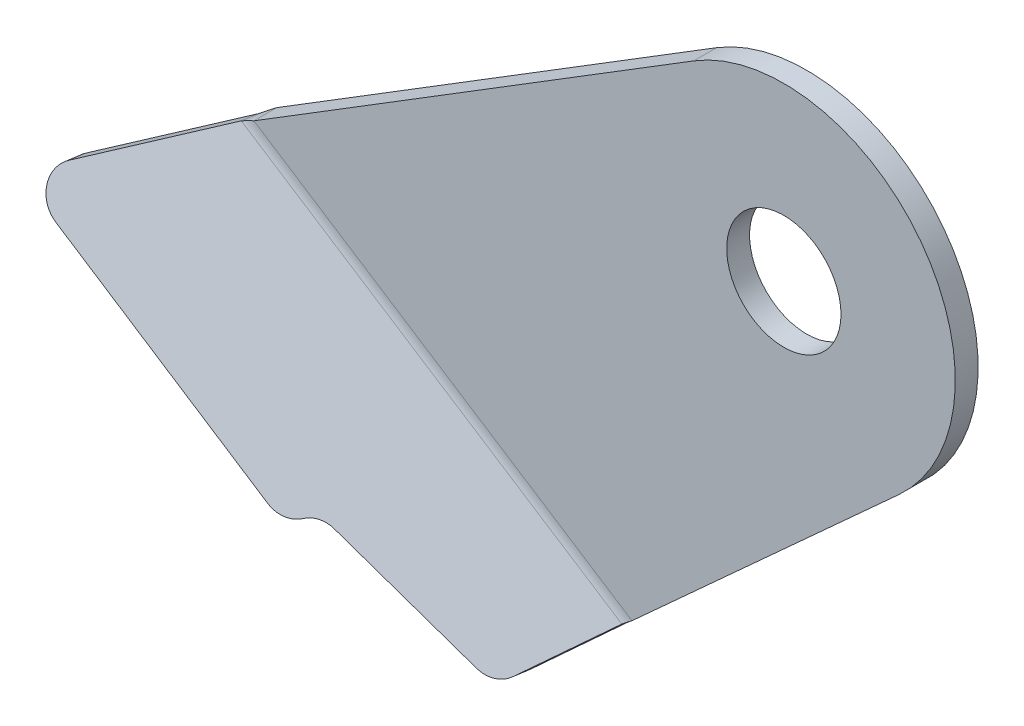
ISO-10303-21;
HEADER;
FILE_DESCRIPTION(('STEP AP214'),'2;1');
FILE_NAME('part.step','',(''),(''),'','','');
FILE_SCHEMA(('AUTOMOTIVE_DESIGN { 1 0 10303 214 1 1 1 1 }'));
ENDSEC;
DATA;
#1=APPLICATION_CONTEXT('core data for automotive mechanical design processes');
#2=APPLICATION_PROTOCOL_DEFINITION('international standard','automotive_design',2000,#1);
#3=PRODUCT_CONTEXT('',#1,'mechanical');
#4=PRODUCT('Part','Part','',(#3));
#5=PRODUCT_RELATED_PRODUCT_CATEGORY('part','',(#4));
#6=PRODUCT_DEFINITION_FORMATION('','',#4);
#7=PRODUCT_DEFINITION_CONTEXT('part definition',#1,'design');
#8=PRODUCT_DEFINITION('design','',#6,#7);
#9=PRODUCT_DEFINITION_SHAPE('','',#8);
#10=(LENGTH_UNIT() NAMED_UNIT(*) SI_UNIT(.MILLI.,.METRE.));
#11=(NAMED_UNIT(*) PLANE_ANGLE_UNIT() SI_UNIT($,.RADIAN.));
#12=(NAMED_UNIT(*) SI_UNIT($,.STERADIAN.) SOLID_ANGLE_UNIT());
#13=UNCERTAINTY_MEASURE_WITH_UNIT(LENGTH_MEASURE(1.E-05),#10,'distance_accuracy_value','');
#14=(GEOMETRIC_REPRESENTATION_CONTEXT(3) GLOBAL_UNCERTAINTY_ASSIGNED_CONTEXT((#13)) GLOBAL_UNIT_ASSIGNED_CONTEXT((#10,
#11,#12)) REPRESENTATION_CONTEXT('',''));
#15=CARTESIAN_POINT('',(0.,0.,0.));
#16=DIRECTION('',(0.,0.,1.));
#17=DIRECTION('',(1.,0.,0.));
#18=AXIS2_PLACEMENT_3D('',#15,#16,#17);
#19=CARTESIAN_POINT('',(-24.1058777703323,-34.2801994195561,7.82589486316085));
#20=DIRECTION('',(0.681189490017153,-0.726810174085109,0.0879081881086429));
#21=DIRECTION('',(0.708244189758442,0.623811060153185,-0.330529770072178));
#22=AXIS2_PLACEMENT_3D('',#19,#20,#21);
#23=PLANE('',#22);
#24=DIRECTION('',(0.708244189758442,0.623811060153185,-0.330529770072178));
#25=VECTOR('',#24,1.);
#26=CARTESIAN_POINT('',(-24.3413285309593,-34.6452150331494,6.63248523476275));
#27=LINE('',#26,#25);
#28=CARTESIAN_POINT('',(-13.2496668437784,-24.8758426387205,1.45612877438336));
#29=VERTEX_POINT('',#28);
#30=CARTESIAN_POINT('',(-9.1381483520542,-21.2544776543686,-0.462671663895728));
#31=VERTEX_POINT('',#30);
#32=EDGE_CURVE('E193',#29,#31,#27,.T.);
#33=ORIENTED_EDGE('',*,*,#32,.T.);
#34=CARTESIAN_POINT('',(-8.90269759142722,-20.8894620407753,0.730737964502371));
#35=CARTESIAN_POINT('',(-9.13814835205418,-21.2544776543686,-0.462671663895733));
#36=B_SPLINE_CURVE_WITH_KNOTS('',1,(#34,#35),.UNSPECIFIED.,.F.,.F.,(2,2),(0.,1.),.UNSPECIFIED.);
#37=CARTESIAN_POINT('',(-8.90269759142722,-20.8894620407753,0.730737964502372));
#38=VERTEX_POINT('',#37);
#39=EDGE_CURVE('E459',#38,#31,#36,.T.);
#40=ORIENTED_EDGE('',*,*,#39,.F.);
#41=DIRECTION('',(0.708244189758442,0.623811060153185,-0.330529770072178));
#42=VECTOR('',#41,1.);
#43=CARTESIAN_POINT('',(-24.1058777703323,-34.2801994195561,7.82589486316085));
#44=LINE('',#43,#42);
#45=CARTESIAN_POINT('',(-13.0142160831514,-24.5108270251272,2.64953840278146));
#46=VERTEX_POINT('',#45);
#47=EDGE_CURVE('E174',#46,#38,#44,.T.);
#48=ORIENTED_EDGE('',*,*,#47,.F.);
#49=DIRECTION('',(-0.185394299706273,-0.287413868971092,-0.939692620785908));
#50=VECTOR('',#49,1.);
#51=CARTESIAN_POINT('',(-13.0142160831514,-24.5108270251272,2.64953840278146));
#52=LINE('',#51,#50);
#53=EDGE_CURVE('E196',#29,#46,#52,.F.);
#54=ORIENTED_EDGE('',*,*,#53,.F.);
#55=EDGE_LOOP('',(#33,#40,#48,#54));
#56=FACE_BOUND('',#55,.T.);
#57=ADVANCED_FACE('F41',(#56),#23,.T.);
#58=CARTESIAN_POINT('',(-0.848453338513683,-1.315343875459,-8.19673876667266));
#59=DIRECTION('',(-0.185394299706273,-0.287413868971092,-0.939692620785908));
#60=DIRECTION('',(0.982280158208957,-0.027470792223861,-0.185394299706273));
#61=AXIS2_PLACEMENT_3D('',#58,#59,#60);
#62=PLANE('',#61);
#63=CARTESIAN_POINT('',(-1793.39457663359,1107.59457283347,6.2885763424069));
#64=DIRECTION('',(0.185394299706273,0.287413868971092,0.939692620785908));
#65=DIRECTION('',(-0.839892739048491,0.542752333990855,-0.000301398579555717));
#66=AXIS2_PLACEMENT_3D('',#63,#64,#65);
#67=ELLIPSE('',#66,5245.43301631365,12.7);
#68=CARTESIAN_POINT('',(-37.1913494955494,-14.2528583972485,2.93050290216552));
#69=VERTEX_POINT('',#68);
#70=CARTESIAN_POINT('',(-25.4191314438474,-21.8767700467203,2.9397780864022));
#71=VERTEX_POINT('',#70);
#72=EDGE_CURVE('E221',#69,#71,#67,.F.);
#73=ORIENTED_EDGE('',*,*,#72,.F.);
#74=CARTESIAN_POINT('',(-36.3801575777716,-13.0009307873301,2.38754693520737));
#75=DIRECTION('',(0.185394299706273,0.287413868971092,0.939692620785908));
#76=DIRECTION('',(0.,-0.956270320284859,0.292484315036369));
#77=AXIS2_PLACEMENT_3D('',#74,#75,#76);
#78=CIRCLE('',#77,1.5875);
#79=CARTESIAN_POINT('',(-37.2370628673345,-11.6851057140426,2.15415038161286));
#80=VERTEX_POINT('',#79);
#81=EDGE_CURVE('E598',#80,#69,#78,.T.);
#82=ORIENTED_EDGE('',*,*,#81,.F.);
#83=DIRECTION('',(-0.82113544446347,-0.479973030996368,0.308808146527806));
#84=VECTOR('',#83,1.);
#85=CARTESIAN_POINT('',(-5.98988507588822,6.57960656426175,-9.59711808823895));
#86=LINE('',#85,#84);
#87=CARTESIAN_POINT('',(-30.2788094741487,-7.61784251880893,-0.462671663895731));
#88=VERTEX_POINT('',#87);
#89=EDGE_CURVE('E192',#88,#80,#86,.T.);
#90=ORIENTED_EDGE('',*,*,#89,.F.);
#91=DIRECTION('',(-0.840341934765575,0.542056669246353,0.));
#92=VECTOR('',#91,1.);
#93=CARTESIAN_POINT('',(-12.3667102144121,-19.1719164763956,-0.462671663895731));
#94=LINE('',#93,#92);
#95=EDGE_CURVE('E164',#31,#88,#94,.T.);
#96=ORIENTED_EDGE('',*,*,#95,.F.);
#97=ORIENTED_EDGE('',*,*,#32,.F.);
#98=CARTESIAN_POINT('',(-14.3310551591806,-23.7220314873604,1.31657452576088));
#99=DIRECTION('',(0.185394299706273,0.287413868971092,0.939692620785908));
#100=DIRECTION('',(0.,-0.956270320284859,0.292484315036369));
#101=AXIS2_PLACEMENT_3D('',#98,#99,#100);
#102=CIRCLE('',#101,1.5875);
#103=CARTESIAN_POINT('',(-14.8987638120875,-25.1046888575057,1.85147800508938));
#104=VERTEX_POINT('',#103);
#105=EDGE_CURVE('E206',#104,#29,#102,.T.);
#106=ORIENTED_EDGE('',*,*,#105,.F.);
#107=DIRECTION('',(-0.915282901619304,0.398513189198997,0.0586894201521124));
#108=VECTOR('',#107,1.);
#109=CARTESIAN_POINT('',(-11.2656716986377,-26.6865332492485,1.61851826212865));
#110=LINE('',#109,#108);
#111=CARTESIAN_POINT('',(-22.3233306196092,-21.8720404690655,2.32755323826937));
#112=VERTEX_POINT('',#111);
#113=EDGE_CURVE('E226',#104,#112,#110,.T.);
#114=ORIENTED_EDGE('',*,*,#113,.T.);
#115=CARTESIAN_POINT('',(-22.8910392725161,-23.2546978392107,2.86245671759787));
#116=DIRECTION('',(0.185394299706273,0.287413868971092,0.939692620785908));
#117=DIRECTION('',(0.,-0.956270320284859,0.292484315036369));
#118=AXIS2_PLACEMENT_3D('',#115,#116,#117);
#119=CIRCLE('',#118,1.5875);
#120=CARTESIAN_POINT('',(-23.7494838080497,-21.9397737590015,2.62963942292625));
#121=VERTEX_POINT('',#120);
#122=EDGE_CURVE('E211',#121,#112,#119,.F.);
#123=ORIENTED_EDGE('',*,*,#122,.F.);
#124=CARTESIAN_POINT('',(-24.6079283435839,-20.6248496787914,2.3968221282545));
#125=DIRECTION('',(0.185394299706273,0.287413868971092,0.939692620785908));
#126=DIRECTION('',(0.,-0.956270320284859,0.292484315036369));
#127=AXIS2_PLACEMENT_3D('',#124,#125,#126);
#128=CIRCLE('',#127,1.5875);
#129=EDGE_CURVE('E11',#71,#121,#128,.T.);
#130=ORIENTED_EDGE('',*,*,#129,.F.);
#131=EDGE_LOOP('',(#73,#82,#90,#96,#97,#106,#114,#123,#130));
#132=FACE_BOUND('',#131,.T.);
#133=ADVANCED_FACE('F438',(#132),#62,.T.);
#134=CARTESIAN_POINT('',(-0.613002577886717,-0.950328261865718,-7.00332913827456));
#135=DIRECTION('',(-0.185394299706273,-0.287413868971092,-0.939692620785908));
#136=DIRECTION('',(0.982280158208957,-0.027470792223861,-0.185394299706273));
#137=AXIS2_PLACEMENT_3D('',#134,#135,#136);
#138=PLANE('',#137);
#139=CARTESIAN_POINT('',(-22.6555885118891,-22.8896822256174,4.05586634599597));
#140=DIRECTION('',(0.185394299706273,0.287413868971092,0.939692620785908));
#141=DIRECTION('',(0.,-0.956270320284859,0.292484315036369));
#142=AXIS2_PLACEMENT_3D('',#139,#140,#141);
#143=CIRCLE('',#142,1.5875);
#144=CARTESIAN_POINT('',(-22.0878798589823,-21.5070248554722,3.52096286666748));
#145=VERTEX_POINT('',#144);
#146=CARTESIAN_POINT('',(-23.5140330474228,-21.5747581454082,3.82304905132436));
#147=VERTEX_POINT('',#146);
#148=EDGE_CURVE('E208',#145,#147,#143,.T.);
#149=ORIENTED_EDGE('',*,*,#148,.F.);
#150=DIRECTION('',(-0.915282901619304,0.398513189198997,0.0586894201521124));
#151=VECTOR('',#150,1.);
#152=CARTESIAN_POINT('',(-11.0302209380108,-26.3215176356552,2.81192789052676));
#153=LINE('',#152,#151);
#154=CARTESIAN_POINT('',(-14.6633130514605,-24.7396732439124,3.04488763348748));
#155=VERTEX_POINT('',#154);
#156=EDGE_CURVE('E222',#155,#145,#153,.T.);
#157=ORIENTED_EDGE('',*,*,#156,.F.);
#158=CARTESIAN_POINT('',(-14.0956043985537,-23.3570158737671,2.50998415415899));
#159=DIRECTION('',(0.185394299706273,0.287413868971092,0.939692620785908));
#160=DIRECTION('',(0.,-0.956270320284859,0.292484315036369));
#161=AXIS2_PLACEMENT_3D('',#158,#159,#160);
#162=CIRCLE('',#161,1.5875);
#163=EDGE_CURVE('E199',#46,#155,#162,.F.);
#164=ORIENTED_EDGE('',*,*,#163,.F.);
#165=ORIENTED_EDGE('',*,*,#47,.T.);
#166=DIRECTION('',(-0.840341934765575,0.542056669246353,0.));
#167=VECTOR('',#166,1.);
#168=CARTESIAN_POINT('',(-12.1312594537851,-18.8069008628023,0.730737964502371));
#169=LINE('',#168,#167);
#170=CARTESIAN_POINT('',(-30.0433587135218,-7.25282690521564,0.730737964502369));
#171=VERTEX_POINT('',#170);
#172=EDGE_CURVE('E139',#38,#171,#169,.T.);
#173=ORIENTED_EDGE('',*,*,#172,.T.);
#174=DIRECTION('',(-0.82113544446347,-0.479973030996368,0.308808146527806));
#175=VECTOR('',#174,1.);
#176=CARTESIAN_POINT('',(-5.75443431526125,6.94462217785504,-8.40370845984084));
#177=LINE('',#176,#175);
#178=CARTESIAN_POINT('',(-37.0016121067075,-11.3200901004493,3.34756001001097));
#179=VERTEX_POINT('',#178);
#180=EDGE_CURVE('E168',#171,#179,#177,.T.);
#181=ORIENTED_EDGE('',*,*,#180,.T.);
#182=CARTESIAN_POINT('',(-36.1447068171446,-12.6359151737369,3.58095656360548));
#183=DIRECTION('',(0.185394299706273,0.287413868971092,0.939692620785908));
#184=DIRECTION('',(0.,-0.956270320284859,0.292484315036369));
#185=AXIS2_PLACEMENT_3D('',#182,#183,#184);
#186=CIRCLE('',#185,1.5875);
#187=CARTESIAN_POINT('',(-36.9558987349224,-13.8878427836553,4.12391253056362));
#188=VERTEX_POINT('',#187);
#189=EDGE_CURVE('E220',#188,#179,#186,.F.);
#190=ORIENTED_EDGE('',*,*,#189,.F.);
#191=CARTESIAN_POINT('',(-1793.15912587296,1107.95958844706,7.48198597080501));
#192=DIRECTION('',(0.185394299706273,0.287413868971092,0.939692620785908));
#193=DIRECTION('',(-0.839892739048491,0.542752333990855,-0.000301398579555717));
#194=AXIS2_PLACEMENT_3D('',#191,#192,#193);
#195=ELLIPSE('',#194,5245.43301631365,12.7);
#196=CARTESIAN_POINT('',(-25.1836806832166,-21.5117544331295,4.13318771480031));
#197=VERTEX_POINT('',#196);
#198=EDGE_CURVE('E219',#188,#197,#195,.F.);
#199=ORIENTED_EDGE('',*,*,#198,.T.);
#200=CARTESIAN_POINT('',(-24.3724775829569,-20.2598340651981,3.5902317566526));
#201=DIRECTION('',(0.185394299706273,0.287413868971092,0.939692620785908));
#202=DIRECTION('',(0.,-0.956270320284859,0.292484315036369));
#203=AXIS2_PLACEMENT_3D('',#200,#201,#202);
#204=CIRCLE('',#203,1.5875);
#205=EDGE_CURVE('E216',#147,#197,#204,.F.);
#206=ORIENTED_EDGE('',*,*,#205,.F.);
#207=EDGE_LOOP('',(#149,#157,#164,#165,#173,#181,#190,#199,#206));
#208=FACE_BOUND('',#207,.T.);
#209=ADVANCED_FACE('F177',(#208),#138,.F.);
#210=CARTESIAN_POINT('',(-1793.15912587296,1107.95958844706,7.48198597080501));
#211=DIRECTION('',(0.185394299706273,0.287413868971092,0.939692620785908));
#212=DIRECTION('',(-0.839892739048491,0.542752333990855,-0.000301398579555717));
#213=AXIS2_PLACEMENT_3D('',#210,#211,#212);
#214=ELLIPSE('',#213,5245.43301631365,12.7);
#215=DIRECTION('',(-0.185394299706273,-0.287413868971092,-0.939692620785908));
#216=VECTOR('',#215,1.);
#217=SURFACE_OF_LINEAR_EXTRUSION('',#214,#216);
#218=ORIENTED_EDGE('',*,*,#198,.F.);
#219=DIRECTION('',(-0.185394299706273,-0.287413868971092,-0.939692620785908));
#220=VECTOR('',#219,1.);
#221=CARTESIAN_POINT('',(-37.1913494955493,-14.2528583972486,2.93050290216554));
#222=LINE('',#221,#220);
#223=EDGE_CURVE('E469',#69,#188,#222,.F.);
#224=ORIENTED_EDGE('',*,*,#223,.F.);
#225=ORIENTED_EDGE('',*,*,#72,.T.);
#226=DIRECTION('',(-0.185394299706273,-0.287413868971092,-0.939692620785908));
#227=VECTOR('',#226,1.);
#228=CARTESIAN_POINT('',(-25.1836806832204,-21.5117544331271,4.13318771480037));
#229=LINE('',#228,#227);
#230=EDGE_CURVE('E49',#197,#71,#229,.T.);
#231=ORIENTED_EDGE('',*,*,#230,.F.);
#232=EDGE_LOOP('',(#218,#224,#225,#231));
#233=FACE_BOUND('',#232,.T.);
#234=ADVANCED_FACE('F241',(#233),#217,.T.);
#235=CARTESIAN_POINT('',(-5.75443431526125,6.94462217785504,-8.40370845984084));
#236=DIRECTION('',(-0.539782859566882,0.828866187897194,-0.147021451083075));
#237=DIRECTION('',(-0.82113544446347,-0.479973030996368,0.308808146527806));
#238=AXIS2_PLACEMENT_3D('',#235,#236,#237);
#239=PLANE('',#238);
#240=ORIENTED_EDGE('',*,*,#180,.F.);
#241=CARTESIAN_POINT('',(-30.2788094741487,-7.61784251880893,-0.462671663895733));
#242=CARTESIAN_POINT('',(-30.0433587135218,-7.25282690521564,0.73073796450237));
#243=B_SPLINE_CURVE_WITH_KNOTS('',1,(#241,#242),.UNSPECIFIED.,.F.,.F.,(2,2),(0.,1.),.UNSPECIFIED.);
#244=EDGE_CURVE('E154',#88,#171,#243,.T.);
#245=ORIENTED_EDGE('',*,*,#244,.F.);
#246=ORIENTED_EDGE('',*,*,#89,.T.);
#247=DIRECTION('',(-0.185394299706273,-0.287413868971092,-0.939692620785908));
#248=VECTOR('',#247,1.);
#249=CARTESIAN_POINT('',(-37.0016121067075,-11.3200901004493,3.34756001001097));
#250=LINE('',#249,#248);
#251=EDGE_CURVE('E170',#179,#80,#250,.T.);
#252=ORIENTED_EDGE('',*,*,#251,.F.);
#253=EDGE_LOOP('',(#240,#245,#246,#252));
#254=FACE_BOUND('',#253,.T.);
#255=ADVANCED_FACE('F169',(#254),#239,.T.);
#256=CARTESIAN_POINT('',(0.,0.,0.635));
#257=DIRECTION('',(0.,0.,-1.));
#258=DIRECTION('',(1.,0.,0.));
#259=AXIS2_PLACEMENT_3D('',#256,#257,#258);
#260=CYLINDRICAL_SURFACE('',#259,9.52499999999997);
#261=DIRECTION('',(0.,0.,1.));
#262=VECTOR('',#261,1.);
#263=CARTESIAN_POINT('',(-5.00758457991113,8.10245158424509,0.635));
#264=LINE('',#263,#262);
#265=CARTESIAN_POINT('',(-5.00758457991113,8.10245158424509,-0.635));
#266=VERTEX_POINT('',#265);
#267=CARTESIAN_POINT('',(-5.00758457991113,8.10245158424509,0.635));
#268=VERTEX_POINT('',#267);
#269=EDGE_CURVE('E347',#266,#268,#264,.T.);
#270=ORIENTED_EDGE('',*,*,#269,.T.);
#271=CARTESIAN_POINT('',(0.,0.,0.635));
#272=DIRECTION('',(0.,0.,1.));
#273=DIRECTION('',(1.,0.,0.));
#274=AXIS2_PLACEMENT_3D('',#271,#272,#273);
#275=CIRCLE('',#274,9.52499999999997);
#276=CARTESIAN_POINT('',(6.40829897849284,-7.04693757615654,0.635));
#277=VERTEX_POINT('',#276);
#278=EDGE_CURVE('E357',#277,#268,#275,.T.);
#279=ORIENTED_EDGE('',*,*,#278,.F.);
#280=DIRECTION('',(0.,0.,1.));
#281=VECTOR('',#280,1.);
#282=CARTESIAN_POINT('',(6.40829897849284,-7.04693757615654,0.635));
#283=LINE('',#282,#281);
#284=CARTESIAN_POINT('',(6.40829897849284,-7.04693757615654,-0.635));
#285=VERTEX_POINT('',#284);
#286=EDGE_CURVE('E360',#285,#277,#283,.T.);
#287=ORIENTED_EDGE('',*,*,#286,.F.);
#288=CARTESIAN_POINT('',(0.,0.,-0.635));
#289=DIRECTION('',(0.,0.,1.));
#290=DIRECTION('',(1.,0.,0.));
#291=AXIS2_PLACEMENT_3D('',#288,#289,#290);
#292=CIRCLE('',#291,9.52499999999997);
#293=EDGE_CURVE('E337',#285,#266,#292,.T.);
#294=ORIENTED_EDGE('',*,*,#293,.T.);
#295=EDGE_LOOP('',(#270,#279,#287,#294));
#296=FACE_BOUND('',#295,.T.);
#297=ADVANCED_FACE('F300',(#296),#260,.T.);
#298=CARTESIAN_POINT('',(0.,0.,0.635));
#299=DIRECTION('',(0.,0.,-1.));
#300=DIRECTION('',(1.,0.,0.));
#301=AXIS2_PLACEMENT_3D('',#298,#299,#300);
#302=CYLINDRICAL_SURFACE('',#301,3.175);
#303=CARTESIAN_POINT('',(0.,0.,0.635));
#304=DIRECTION('',(0.,0.,1.));
#305=DIRECTION('',(1.,0.,0.));
#306=AXIS2_PLACEMENT_3D('',#303,#304,#305);
#307=CIRCLE('',#306,3.175);
#308=CARTESIAN_POINT('',(3.175,0.,0.635));
#309=VERTEX_POINT('',#308);
#310=EDGE_CURVE('E351',#309,#309,#307,.T.);
#311=ORIENTED_EDGE('',*,*,#310,.T.);
#312=EDGE_LOOP('',(#311));
#313=FACE_BOUND('',#312,.T.);
#314=CARTESIAN_POINT('',(0.,0.,-0.635));
#315=DIRECTION('',(0.,0.,1.));
#316=DIRECTION('',(1.,0.,0.));
#317=AXIS2_PLACEMENT_3D('',#314,#315,#316);
#318=CIRCLE('',#317,3.175);
#319=CARTESIAN_POINT('',(3.175,0.,-0.635));
#320=VERTEX_POINT('',#319);
#321=EDGE_CURVE('E354',#320,#320,#318,.T.);
#322=ORIENTED_EDGE('',*,*,#321,.F.);
#323=EDGE_LOOP('',(#322));
#324=FACE_BOUND('',#323,.T.);
#325=ADVANCED_FACE('F430',(#313,#324),#302,.F.);
#326=CARTESIAN_POINT('',(0.,0.,0.635));
#327=DIRECTION('',(0.,0.,-1.));
#328=DIRECTION('',(1.,0.,0.));
#329=AXIS2_PLACEMENT_3D('',#326,#327,#328);
#330=PLANE('',#329);
#331=ORIENTED_EDGE('',*,*,#310,.F.);
#332=EDGE_LOOP('',(#331));
#333=FACE_BOUND('',#332,.T.);
#334=DIRECTION('',(0.739835966000689,0.672787294329959,0.));
#335=VECTOR('',#334,1.);
#336=CARTESIAN_POINT('',(-24.9102407943313,-35.5271907733956,0.635));
#337=LINE('',#336,#335);
#338=CARTESIAN_POINT('',(-8.43499419259654,-20.5450364932809,0.635));
#339=VERTEX_POINT('',#338);
#340=EDGE_CURVE('E404',#339,#277,#337,.T.);
#341=ORIENTED_EDGE('',*,*,#340,.T.);
#342=ORIENTED_EDGE('',*,*,#278,.T.);
#343=DIRECTION('',(-0.850651084960117,-0.525730664557601,0.));
#344=VECTOR('',#343,1.);
#345=CARTESIAN_POINT('',(-5.00758457991113,8.10245158424509,0.635));
#346=LINE('',#345,#344);
#347=CARTESIAN_POINT('',(-29.4386628353385,-6.99676739539894,0.635));
#348=VERTEX_POINT('',#347);
#349=EDGE_CURVE('E350',#268,#348,#346,.T.);
#350=ORIENTED_EDGE('',*,*,#349,.T.);
#351=DIRECTION('',(-0.840341934765575,0.542056669246353,0.));
#352=VECTOR('',#351,1.);
#353=CARTESIAN_POINT('',(-11.8369460030014,-18.3506313458107,0.635));
#354=LINE('',#353,#352);
#355=EDGE_CURVE('E142',#339,#348,#354,.T.);
#356=ORIENTED_EDGE('',*,*,#355,.F.);
#357=EDGE_LOOP('',(#341,#342,#350,#356));
#358=FACE_BOUND('',#357,.T.);
#359=ADVANCED_FACE('F389',(#333,#358),#330,.F.);
#360=CARTESIAN_POINT('',(-5.00758457991113,8.10245158424509,0.635));
#361=DIRECTION('',(-0.525730664557601,0.850651084960117,0.));
#362=DIRECTION('',(-0.850651084960117,-0.525730664557601,0.));
#363=AXIS2_PLACEMENT_3D('',#360,#361,#362);
#364=PLANE('',#363);
#365=CARTESIAN_POINT('',(-29.4386628353385,-6.99676739539894,0.635));
#366=CARTESIAN_POINT('',(-29.4386628353385,-6.99676739539894,-0.635));
#367=B_SPLINE_CURVE_WITH_KNOTS('',1,(#365,#366),.UNSPECIFIED.,.F.,.F.,(2,2),(0.,1.),.UNSPECIFIED.);
#368=CARTESIAN_POINT('',(-29.4386628353385,-6.99676739539895,-0.635));
#369=VERTEX_POINT('',#368);
#370=EDGE_CURVE('E333',#369,#348,#367,.F.);
#371=ORIENTED_EDGE('',*,*,#370,.T.);
#372=ORIENTED_EDGE('',*,*,#349,.F.);
#373=ORIENTED_EDGE('',*,*,#269,.F.);
#374=DIRECTION('',(-0.850651084960117,-0.525730664557601,0.));
#375=VECTOR('',#374,1.);
#376=CARTESIAN_POINT('',(-5.00758457991113,8.10245158424509,-0.635));
#377=LINE('',#376,#375);
#378=EDGE_CURVE('E345',#266,#369,#377,.T.);
#379=ORIENTED_EDGE('',*,*,#378,.T.);
#380=EDGE_LOOP('',(#371,#372,#373,#379));
#381=FACE_BOUND('',#380,.T.);
#382=ADVANCED_FACE('F378',(#381),#364,.T.);
#383=CARTESIAN_POINT('',(0.,0.,-0.635));
#384=DIRECTION('',(0.,0.,-1.));
#385=DIRECTION('',(1.,0.,0.));
#386=AXIS2_PLACEMENT_3D('',#383,#384,#385);
#387=PLANE('',#386);
#388=DIRECTION('',(-0.840341934765575,0.542056669246353,0.));
#389=VECTOR('',#388,1.);
#390=CARTESIAN_POINT('',(-11.8369460030014,-18.3506313458107,-0.635));
#391=LINE('',#390,#389);
#392=CARTESIAN_POINT('',(-8.43499419259654,-20.5450364932809,-0.635));
#393=VERTEX_POINT('',#392);
#394=EDGE_CURVE('E376',#393,#369,#391,.T.);
#395=ORIENTED_EDGE('',*,*,#394,.T.);
#396=ORIENTED_EDGE('',*,*,#378,.F.);
#397=ORIENTED_EDGE('',*,*,#293,.F.);
#398=DIRECTION('',(0.739835966000689,0.672787294329959,0.));
#399=VECTOR('',#398,1.);
#400=CARTESIAN_POINT('',(-24.9102407943313,-35.5271907733956,-0.635));
#401=LINE('',#400,#399);
#402=EDGE_CURVE('E346',#393,#285,#401,.T.);
#403=ORIENTED_EDGE('',*,*,#402,.F.);
#404=EDGE_LOOP('',(#395,#396,#397,#403));
#405=FACE_BOUND('',#404,.T.);
#406=ORIENTED_EDGE('',*,*,#321,.T.);
#407=EDGE_LOOP('',(#406));
#408=FACE_BOUND('',#407,.T.);
#409=ADVANCED_FACE('F388',(#405,#408),#387,.T.);
#410=CARTESIAN_POINT('',(-24.9102407943313,-35.5271907733956,0.635));
#411=DIRECTION('',(0.672787294329959,-0.739835966000689,0.));
#412=DIRECTION('',(0.739835966000689,0.672787294329959,0.));
#413=AXIS2_PLACEMENT_3D('',#410,#411,#412);
#414=PLANE('',#413);
#415=CARTESIAN_POINT('',(-8.43499419259654,-20.5450364932809,-0.635));
#416=CARTESIAN_POINT('',(-8.43499419259654,-20.5450364932809,0.635));
#417=B_SPLINE_CURVE_WITH_KNOTS('',1,(#415,#416),.UNSPECIFIED.,.F.,.F.,(2,2),(0.,1.),.UNSPECIFIED.);
#418=EDGE_CURVE('E149',#339,#393,#417,.F.);
#419=ORIENTED_EDGE('',*,*,#418,.T.);
#420=ORIENTED_EDGE('',*,*,#402,.T.);
#421=ORIENTED_EDGE('',*,*,#286,.T.);
#422=ORIENTED_EDGE('',*,*,#340,.F.);
#423=EDGE_LOOP('',(#419,#420,#421,#422));
#424=FACE_BOUND('',#423,.T.);
#425=ADVANCED_FACE('F296',(#424),#414,.T.);
#426=CARTESIAN_POINT('',(-8.43499419259654,-20.5450364932809,-0.635));
#427=CARTESIAN_POINT('',(-8.67310470949282,-20.7872459960336,-0.634999999999999));
#428=CARTESIAN_POINT('',(-8.91091080277086,-21.0291243424146,-0.576430366716115));
#429=CARTESIAN_POINT('',(-9.13814835205418,-21.2544776543686,-0.462671663895733));
#430=CARTESIAN_POINT('',(-8.43499419259654,-20.5450364932809,0.635));
#431=CARTESIAN_POINT('',(-8.59297047409794,-20.6630185565893,0.635));
#432=CARTESIAN_POINT('',(-8.75076168538805,-20.7808442766087,0.667540381138556));
#433=CARTESIAN_POINT('',(-8.90269759142722,-20.8894620407753,0.730737964502371));
#434=B_SPLINE_SURFACE_WITH_KNOTS('',1,3,((#426,#427,#428,#429),(#430,#431,#432,#433)),
.UNSPECIFIED.,.F.,.F.,.F.,(2,2),(4,4),(0.,1.),(0.,1.),.UNSPECIFIED.);
#435=CARTESIAN_POINT('',(-8.43499419259654,-20.5450364932809,0.635));
#436=CARTESIAN_POINT('',(-8.59297047409794,-20.6630185565893,0.635));
#437=CARTESIAN_POINT('',(-8.75076168538805,-20.7808442766087,0.667540381138556));
#438=CARTESIAN_POINT('',(-8.90269759142722,-20.8894620407753,0.730737964502371));
#439=B_SPLINE_CURVE_WITH_KNOTS('',3,(#435,#436,#437,#438),.UNSPECIFIED.,.F.,.F.,(4,4),(0.,1.),.UNSPECIFIED.);
#440=EDGE_CURVE('E150',#339,#38,#439,.T.);
#441=CARTESIAN_POINT('',(-9.13814835205418,-21.2544776543686,-0.462671663895733));
#442=CARTESIAN_POINT('',(-8.91091080277086,-21.0291243424146,-0.576430366716115));
#443=CARTESIAN_POINT('',(-8.67310470949282,-20.7872459960336,-0.634999999999999));
#444=CARTESIAN_POINT('',(-8.43499419259654,-20.5450364932809,-0.635));
#445=B_SPLINE_CURVE_WITH_KNOTS('',3,(#441,#442,#443,#444),.UNSPECIFIED.,.F.,.F.,(4,4),(0.,1.),.UNSPECIFIED.);
#446=EDGE_CURVE('E224',#393,#31,#445,.F.);
#447=ORIENTED_EDGE('',*,*,#418,.F.);
#448=ORIENTED_EDGE('',*,*,#440,.T.);
#449=ORIENTED_EDGE('',*,*,#39,.T.);
#450=ORIENTED_EDGE('',*,*,#446,.F.);
#451=EDGE_LOOP('',(#447,#448,#449,#450));
#452=FACE_BOUND('',#451,.T.);
#453=ADVANCED_FACE('F285',(#452),#434,.T.);
#454=CARTESIAN_POINT('',(-30.2788094741487,-7.61784251880893,-0.462671663895733));
#455=CARTESIAN_POINT('',(-30.0058980914954,-7.42196062627701,-0.57642735900108));
#456=CARTESIAN_POINT('',(-29.7224468981298,-7.20950503306149,-0.635));
#457=CARTESIAN_POINT('',(-29.4386628353385,-6.99676739539894,-0.635));
#458=CARTESIAN_POINT('',(-30.0433587135218,-7.25282690521564,0.73073796450237));
#459=CARTESIAN_POINT('',(-29.8457557190551,-7.17367969137479,0.667544453758794));
#460=CARTESIAN_POINT('',(-29.6423058160096,-7.08527830492129,0.635));
#461=CARTESIAN_POINT('',(-29.4386628353385,-6.99676739539894,0.635));
#462=B_SPLINE_SURFACE_WITH_KNOTS('',1,3,((#454,#455,#456,#457),(#458,#459,#460,#461)),
.UNSPECIFIED.,.F.,.F.,.F.,(2,2),(4,4),(0.,1.),(0.,1.),.UNSPECIFIED.);
#463=CARTESIAN_POINT('',(-30.0433587135218,-7.25282690521564,0.73073796450237));
#464=CARTESIAN_POINT('',(-29.8457557190551,-7.17367969137479,0.667544453758794));
#465=CARTESIAN_POINT('',(-29.6423058160096,-7.08527830492129,0.635));
#466=CARTESIAN_POINT('',(-29.4386628353385,-6.99676739539894,0.635));
#467=B_SPLINE_CURVE_WITH_KNOTS('',3,(#463,#464,#465,#466),.UNSPECIFIED.,.F.,.F.,(4,4),(0.,1.),.UNSPECIFIED.);
#468=EDGE_CURVE('E134',#171,#348,#467,.T.);
#469=CARTESIAN_POINT('',(-29.4386628353385,-6.99676739539894,-0.635));
#470=CARTESIAN_POINT('',(-29.7224468981298,-7.20950503306149,-0.635));
#471=CARTESIAN_POINT('',(-30.0058980914954,-7.42196062627701,-0.57642735900108));
#472=CARTESIAN_POINT('',(-30.2788094741487,-7.61784251880893,-0.462671663895733));
#473=B_SPLINE_CURVE_WITH_KNOTS('',3,(#469,#470,#471,#472),.UNSPECIFIED.,.F.,.F.,(4,4),(0.,1.),.UNSPECIFIED.);
#474=EDGE_CURVE('E158',#88,#369,#473,.F.);
#475=ORIENTED_EDGE('',*,*,#244,.T.);
#476=ORIENTED_EDGE('',*,*,#468,.T.);
#477=ORIENTED_EDGE('',*,*,#370,.F.);
#478=ORIENTED_EDGE('',*,*,#474,.F.);
#479=EDGE_LOOP('',(#475,#476,#477,#478));
#480=FACE_BOUND('',#479,.T.);
#481=ADVANCED_FACE('F157',(#480),#462,.T.);
#482=CARTESIAN_POINT('',(2.85521156964921,-27.827704509005,2.2225));
#483=DIRECTION('',(-0.840341934765575,0.542056669246353,0.));
#484=DIRECTION('',(-0.542056669246353,-0.840341934765575,0.));
#485=AXIS2_PLACEMENT_3D('',#482,#483,#484);
#486=CYLINDRICAL_SURFACE('',#485,1.5875);
#487=ORIENTED_EDGE('',*,*,#468,.F.);
#488=ORIENTED_EDGE('',*,*,#172,.F.);
#489=ORIENTED_EDGE('',*,*,#440,.F.);
#490=ORIENTED_EDGE('',*,*,#355,.T.);
#491=EDGE_LOOP('',(#487,#488,#489,#490));
#492=FACE_BOUND('',#491,.T.);
#493=ADVANCED_FACE('F137',(#492),#486,.F.);
#494=CARTESIAN_POINT('',(2.85521156964921,-27.827704509005,2.2225));
#495=DIRECTION('',(-0.840341934765575,0.542056669246353,0.));
#496=DIRECTION('',(-0.542056669246353,-0.840341934765575,0.));
#497=AXIS2_PLACEMENT_3D('',#494,#495,#496);
#498=CYLINDRICAL_SURFACE('',#497,2.8575);
#499=ORIENTED_EDGE('',*,*,#474,.T.);
#500=ORIENTED_EDGE('',*,*,#394,.F.);
#501=ORIENTED_EDGE('',*,*,#446,.T.);
#502=ORIENTED_EDGE('',*,*,#95,.T.);
#503=EDGE_LOOP('',(#499,#500,#501,#502));
#504=FACE_BOUND('',#503,.T.);
#505=ADVANCED_FACE('F248',(#504),#498,.T.);
#506=CARTESIAN_POINT('',(-36.2624321974581,-12.8184229805335,2.9842517494064));
#507=DIRECTION('',(-0.185394299706273,-0.287413868971092,-0.939692620785908));
#508=DIRECTION('',(0.,-0.956270320284859,0.292484315036369));
#509=AXIS2_PLACEMENT_3D('',#506,#507,#508);
#510=CYLINDRICAL_SURFACE('',#509,1.5875);
#511=ORIENTED_EDGE('',*,*,#189,.T.);
#512=ORIENTED_EDGE('',*,*,#251,.T.);
#513=ORIENTED_EDGE('',*,*,#81,.T.);
#514=ORIENTED_EDGE('',*,*,#223,.T.);
#515=EDGE_LOOP('',(#511,#512,#513,#514));
#516=FACE_BOUND('',#515,.T.);
#517=ADVANCED_FACE('F448',(#516),#510,.T.);
#518=CARTESIAN_POINT('',(-11.2656716986377,-26.6865332492485,1.61851826212865));
#519=DIRECTION('',(0.357611749862567,0.870965272532443,-0.336947073592753));
#520=DIRECTION('',(-0.915282901619304,0.398513189198997,0.0586894201521124));
#521=AXIS2_PLACEMENT_3D('',#518,#519,#520);
#522=PLANE('',#521);
#523=ORIENTED_EDGE('',*,*,#156,.T.);
#524=DIRECTION('',(-0.185394299706273,-0.287413868971092,-0.939692620785908));
#525=VECTOR('',#524,1.);
#526=CARTESIAN_POINT('',(-22.0878798589823,-21.5070248554722,3.52096286666748));
#527=LINE('',#526,#525);
#528=EDGE_CURVE('E202',#112,#145,#527,.F.);
#529=ORIENTED_EDGE('',*,*,#528,.F.);
#530=ORIENTED_EDGE('',*,*,#113,.F.);
#531=DIRECTION('',(0.185394299706273,0.287413868971092,0.939692620785908));
#532=VECTOR('',#531,1.);
#533=CARTESIAN_POINT('',(-14.8987638120875,-25.1046888575057,1.85147800508938));
#534=LINE('',#533,#532);
#535=EDGE_CURVE('E204',#155,#104,#534,.F.);
#536=ORIENTED_EDGE('',*,*,#535,.F.);
#537=EDGE_LOOP('',(#523,#529,#530,#536));
#538=FACE_BOUND('',#537,.T.);
#539=ADVANCED_FACE('F244',(#538),#522,.F.);
#540=CARTESIAN_POINT('',(-14.0956043985537,-23.3570158737671,2.50998415415899));
#541=DIRECTION('',(-0.185394299706273,-0.287413868971092,-0.939692620785908));
#542=DIRECTION('',(0.,-0.956270320284859,0.292484315036369));
#543=AXIS2_PLACEMENT_3D('',#540,#541,#542);
#544=CYLINDRICAL_SURFACE('',#543,1.5875);
#545=ORIENTED_EDGE('',*,*,#105,.T.);
#546=ORIENTED_EDGE('',*,*,#53,.T.);
#547=ORIENTED_EDGE('',*,*,#163,.T.);
#548=ORIENTED_EDGE('',*,*,#535,.T.);
#549=EDGE_LOOP('',(#545,#546,#547,#548));
#550=FACE_BOUND('',#549,.T.);
#551=ADVANCED_FACE('F561',(#550),#544,.T.);
#552=CARTESIAN_POINT('',(-22.8910392725161,-23.2546978392107,2.86245671759787));
#553=DIRECTION('',(-0.185394299706273,-0.287413868971092,-0.939692620785908));
#554=DIRECTION('',(0.,-0.956270320284859,0.292484315036369));
#555=AXIS2_PLACEMENT_3D('',#552,#553,#554);
#556=CYLINDRICAL_SURFACE('',#555,1.5875);
#557=ORIENTED_EDGE('',*,*,#122,.T.);
#558=ORIENTED_EDGE('',*,*,#528,.T.);
#559=ORIENTED_EDGE('',*,*,#148,.T.);
#560=DIRECTION('',(-0.185394299706273,-0.287413868971092,-0.939692620785908));
#561=VECTOR('',#560,1.);
#562=CARTESIAN_POINT('',(-23.7494838080497,-21.9397737590015,2.62963942292625));
#563=LINE('',#562,#561);
#564=EDGE_CURVE('E214',#121,#147,#563,.F.);
#565=ORIENTED_EDGE('',*,*,#564,.F.);
#566=EDGE_LOOP('',(#557,#558,#559,#565));
#567=FACE_BOUND('',#566,.T.);
#568=ADVANCED_FACE('F571',(#567),#556,.F.);
#569=CARTESIAN_POINT('',(-24.4902029632705,-20.4423418719949,2.99352694245317));
#570=DIRECTION('',(-0.185394299706273,-0.287413868971092,-0.939692620785908));
#571=DIRECTION('',(0.,-0.956270320284859,0.292484315036369));
#572=AXIS2_PLACEMENT_3D('',#569,#570,#571);
#573=CYLINDRICAL_SURFACE('',#572,1.5875);
#574=ORIENTED_EDGE('',*,*,#129,.T.);
#575=ORIENTED_EDGE('',*,*,#564,.T.);
#576=ORIENTED_EDGE('',*,*,#205,.T.);
#577=ORIENTED_EDGE('',*,*,#230,.T.);
#578=EDGE_LOOP('',(#574,#575,#576,#577));
#579=FACE_BOUND('',#578,.T.);
#580=ADVANCED_FACE('F43',(#579),#573,.T.);
#581=CLOSED_SHELL('',(#57,#133,#209,#234,#255,#297,#325,#359,#382,#409,#425,#453,#481,#493,#505,
#517,#539,#551,#568,#580));
#582=MANIFOLD_SOLID_BREP('B2',#581);
#583=ADVANCED_BREP_SHAPE_REPRESENTATION('',(#18,#582),#14);
#584=SHAPE_DEFINITION_REPRESENTATION(#9,#583);
ENDSEC;
END-ISO-10303-21;
